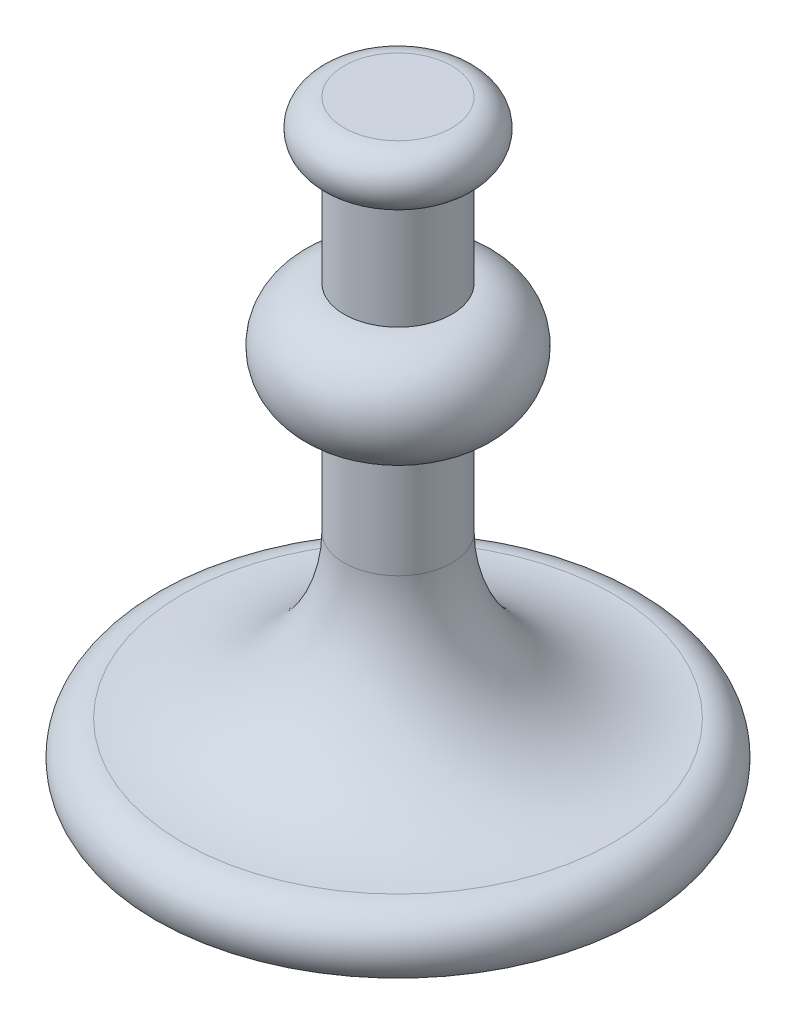
ISO-10303-21;
HEADER;
FILE_DESCRIPTION(('STEP AP214'),'2;1');
FILE_NAME('part.step','',(''),(''),'','','');
FILE_SCHEMA(('AUTOMOTIVE_DESIGN { 1 0 10303 214 1 1 1 1 }'));
ENDSEC;
DATA;
#1=APPLICATION_CONTEXT('core data for automotive mechanical design processes');
#2=APPLICATION_PROTOCOL_DEFINITION('international standard','automotive_design',2000,#1);
#3=PRODUCT_CONTEXT('',#1,'mechanical');
#4=PRODUCT('Part','Part','',(#3));
#5=PRODUCT_RELATED_PRODUCT_CATEGORY('part','',(#4));
#6=PRODUCT_DEFINITION_FORMATION('','',#4);
#7=PRODUCT_DEFINITION_CONTEXT('part definition',#1,'design');
#8=PRODUCT_DEFINITION('design','',#6,#7);
#9=PRODUCT_DEFINITION_SHAPE('','',#8);
#10=(LENGTH_UNIT() NAMED_UNIT(*) SI_UNIT(.MILLI.,.METRE.));
#11=(NAMED_UNIT(*) PLANE_ANGLE_UNIT() SI_UNIT($,.RADIAN.));
#12=(NAMED_UNIT(*) SI_UNIT($,.STERADIAN.) SOLID_ANGLE_UNIT());
#13=UNCERTAINTY_MEASURE_WITH_UNIT(LENGTH_MEASURE(1.E-05),#10,'distance_accuracy_value','');
#14=(GEOMETRIC_REPRESENTATION_CONTEXT(3) GLOBAL_UNCERTAINTY_ASSIGNED_CONTEXT((#13)) GLOBAL_UNIT_ASSIGNED_CONTEXT((#10,
#11,#12)) REPRESENTATION_CONTEXT('',''));
#15=CARTESIAN_POINT('',(0.,0.,0.));
#16=DIRECTION('',(0.,0.,1.));
#17=DIRECTION('',(1.,0.,0.));
#18=AXIS2_PLACEMENT_3D('',#15,#16,#17);
#19=CARTESIAN_POINT('',(0.,0.,0.));
#20=DIRECTION('',(0.,-1.,0.));
#21=DIRECTION('',(0.,0.,-1.));
#22=AXIS2_PLACEMENT_3D('',#19,#20,#21);
#23=PLANE('',#22);
#24=CARTESIAN_POINT('',(0.,0.,0.));
#25=DIRECTION('',(0.,-1.,0.));
#26=DIRECTION('',(0.,0.,-1.));
#27=AXIS2_PLACEMENT_3D('',#24,#25,#26);
#28=CIRCLE('',#27,90.);
#29=CARTESIAN_POINT('',(0.,0.,-90.));
#30=VERTEX_POINT('',#29);
#31=EDGE_CURVE('E57',#30,#30,#28,.T.);
#32=ORIENTED_EDGE('',*,*,#31,.T.);
#33=EDGE_LOOP('',(#32));
#34=FACE_BOUND('',#33,.T.);
#35=ADVANCED_FACE('F32',(#34),#23,.T.);
#36=CARTESIAN_POINT('',(0.,220.,0.));
#37=DIRECTION('',(0.,1.,0.));
#38=DIRECTION('',(0.,0.,1.));
#39=AXIS2_PLACEMENT_3D('',#36,#37,#38);
#40=PLANE('',#39);
#41=CARTESIAN_POINT('',(0.,220.,0.));
#42=DIRECTION('',(0.,-1.,0.));
#43=DIRECTION('',(0.,0.,-1.));
#44=AXIS2_PLACEMENT_3D('',#41,#42,#43);
#45=CIRCLE('',#44,20.);
#46=CARTESIAN_POINT('',(0.,220.,-20.));
#47=VERTEX_POINT('',#46);
#48=EDGE_CURVE('E10',#47,#47,#45,.T.);
#49=ORIENTED_EDGE('',*,*,#48,.F.);
#50=EDGE_LOOP('',(#49));
#51=FACE_BOUND('',#50,.T.);
#52=ADVANCED_FACE('F74',(#51),#40,.T.);
#53=CARTESIAN_POINT('',(0.,210.,0.));
#54=DIRECTION('',(0.,-1.,0.));
#55=DIRECTION('',(0.,0.,-1.));
#56=AXIS2_PLACEMENT_3D('',#53,#54,#55);
#57=TOROIDAL_SURFACE('',#56,20.,10.);
#58=ORIENTED_EDGE('',*,*,#48,.T.);
#59=EDGE_LOOP('',(#58));
#60=FACE_BOUND('',#59,.T.);
#61=CARTESIAN_POINT('',(0.,200.,0.));
#62=DIRECTION('',(0.,-1.,0.));
#63=DIRECTION('',(0.,0.,-1.));
#64=AXIS2_PLACEMENT_3D('',#61,#62,#63);
#65=CIRCLE('',#64,20.);
#66=CARTESIAN_POINT('',(0.,200.,-20.));
#67=VERTEX_POINT('',#66);
#68=EDGE_CURVE('E38',#67,#67,#65,.T.);
#69=ORIENTED_EDGE('',*,*,#68,.F.);
#70=EDGE_LOOP('',(#69));
#71=FACE_BOUND('',#70,.T.);
#72=ADVANCED_FACE('F78',(#60,#71),#57,.T.);
#73=CARTESIAN_POINT('',(0.,0.,0.));
#74=DIRECTION('',(0.,-1.,0.));
#75=DIRECTION('',(0.,0.,-1.));
#76=AXIS2_PLACEMENT_3D('',#73,#74,#75);
#77=CYLINDRICAL_SURFACE('',#76,20.);
#78=ORIENTED_EDGE('',*,*,#68,.T.);
#79=EDGE_LOOP('',(#78));
#80=FACE_BOUND('',#79,.T.);
#81=CARTESIAN_POINT('',(0.,160.,0.));
#82=DIRECTION('',(0.,-1.,0.));
#83=DIRECTION('',(0.,0.,-1.));
#84=AXIS2_PLACEMENT_3D('',#81,#82,#83);
#85=CIRCLE('',#84,20.);
#86=CARTESIAN_POINT('',(0.,160.,-20.));
#87=VERTEX_POINT('',#86);
#88=EDGE_CURVE('E42',#87,#87,#85,.T.);
#89=ORIENTED_EDGE('',*,*,#88,.F.);
#90=EDGE_LOOP('',(#89));
#91=FACE_BOUND('',#90,.T.);
#92=ADVANCED_FACE('F83',(#80,#91),#77,.T.);
#93=CARTESIAN_POINT('',(0.,140.,0.));
#94=DIRECTION('',(0.,-1.,0.));
#95=DIRECTION('',(0.,0.,-1.));
#96=AXIS2_PLACEMENT_3D('',#93,#94,#95);
#97=DEGENERATE_TOROIDAL_SURFACE('',#96,20.,20.,.T.);
#98=ORIENTED_EDGE('',*,*,#88,.T.);
#99=EDGE_LOOP('',(#98));
#100=FACE_BOUND('',#99,.T.);
#101=CARTESIAN_POINT('',(0.,120.,0.));
#102=DIRECTION('',(0.,-1.,0.));
#103=DIRECTION('',(0.,0.,-1.));
#104=AXIS2_PLACEMENT_3D('',#101,#102,#103);
#105=CIRCLE('',#104,20.);
#106=CARTESIAN_POINT('',(0.,120.,-20.));
#107=VERTEX_POINT('',#106);
#108=EDGE_CURVE('E46',#107,#107,#105,.T.);
#109=ORIENTED_EDGE('',*,*,#108,.F.);
#110=EDGE_LOOP('',(#109));
#111=FACE_BOUND('',#110,.T.);
#112=ADVANCED_FACE('F88',(#100,#111),#97,.T.);
#113=CARTESIAN_POINT('',(0.,0.,0.));
#114=DIRECTION('',(0.,-1.,0.));
#115=DIRECTION('',(0.,0.,-1.));
#116=AXIS2_PLACEMENT_3D('',#113,#114,#115);
#117=CYLINDRICAL_SURFACE('',#116,20.);
#118=ORIENTED_EDGE('',*,*,#108,.T.);
#119=EDGE_LOOP('',(#118));
#120=FACE_BOUND('',#119,.T.);
#121=CARTESIAN_POINT('',(0.,80.,0.));
#122=DIRECTION('',(0.,-1.,0.));
#123=DIRECTION('',(0.,0.,-1.));
#124=AXIS2_PLACEMENT_3D('',#121,#122,#123);
#125=CIRCLE('',#124,20.);
#126=CARTESIAN_POINT('',(0.,80.,-20.));
#127=VERTEX_POINT('',#126);
#128=EDGE_CURVE('E51',#127,#127,#125,.T.);
#129=ORIENTED_EDGE('',*,*,#128,.F.);
#130=EDGE_LOOP('',(#129));
#131=FACE_BOUND('',#130,.T.);
#132=ADVANCED_FACE('F70',(#120,#131),#117,.T.);
#133=CARTESIAN_POINT('',(0.,80.,0.));
#134=DIRECTION('',(0.,-1.,0.));
#135=DIRECTION('',(0.,0.,-1.));
#136=AXIS2_PLACEMENT_3D('',#133,#134,#135);
#137=TOROIDAL_SURFACE('',#136,80.,60.);
#138=ORIENTED_EDGE('',*,*,#128,.T.);
#139=EDGE_LOOP('',(#138));
#140=FACE_BOUND('',#139,.T.);
#141=CARTESIAN_POINT('',(0.,20.,0.));
#142=DIRECTION('',(0.,-1.,0.));
#143=DIRECTION('',(0.,0.,-1.));
#144=AXIS2_PLACEMENT_3D('',#141,#142,#143);
#145=CIRCLE('',#144,80.);
#146=CARTESIAN_POINT('',(0.,20.,-80.));
#147=VERTEX_POINT('',#146);
#148=EDGE_CURVE('E54',#147,#147,#145,.T.);
#149=ORIENTED_EDGE('',*,*,#148,.F.);
#150=EDGE_LOOP('',(#149));
#151=FACE_BOUND('',#150,.T.);
#152=ADVANCED_FACE('F64',(#140,#151),#137,.F.);
#153=CARTESIAN_POINT('',(0.,7.50000000000001,0.));
#154=DIRECTION('',(0.,-1.,0.));
#155=DIRECTION('',(0.,0.,-1.));
#156=AXIS2_PLACEMENT_3D('',#153,#154,#155);
#157=TOROIDAL_SURFACE('',#156,80.,12.5);
#158=ORIENTED_EDGE('',*,*,#148,.T.);
#159=EDGE_LOOP('',(#158));
#160=FACE_BOUND('',#159,.T.);
#161=ORIENTED_EDGE('',*,*,#31,.F.);
#162=EDGE_LOOP('',(#161));
#163=FACE_BOUND('',#162,.T.);
#164=ADVANCED_FACE('F62',(#160,#163),#157,.T.);
#165=CLOSED_SHELL('',(#35,#52,#72,#92,#112,#132,#152,#164));
#166=MANIFOLD_SOLID_BREP('B2',#165);
#167=ADVANCED_BREP_SHAPE_REPRESENTATION('',(#18,#166),#14);
#168=SHAPE_DEFINITION_REPRESENTATION(#9,#167);
ENDSEC;
END-ISO-10303-21;
